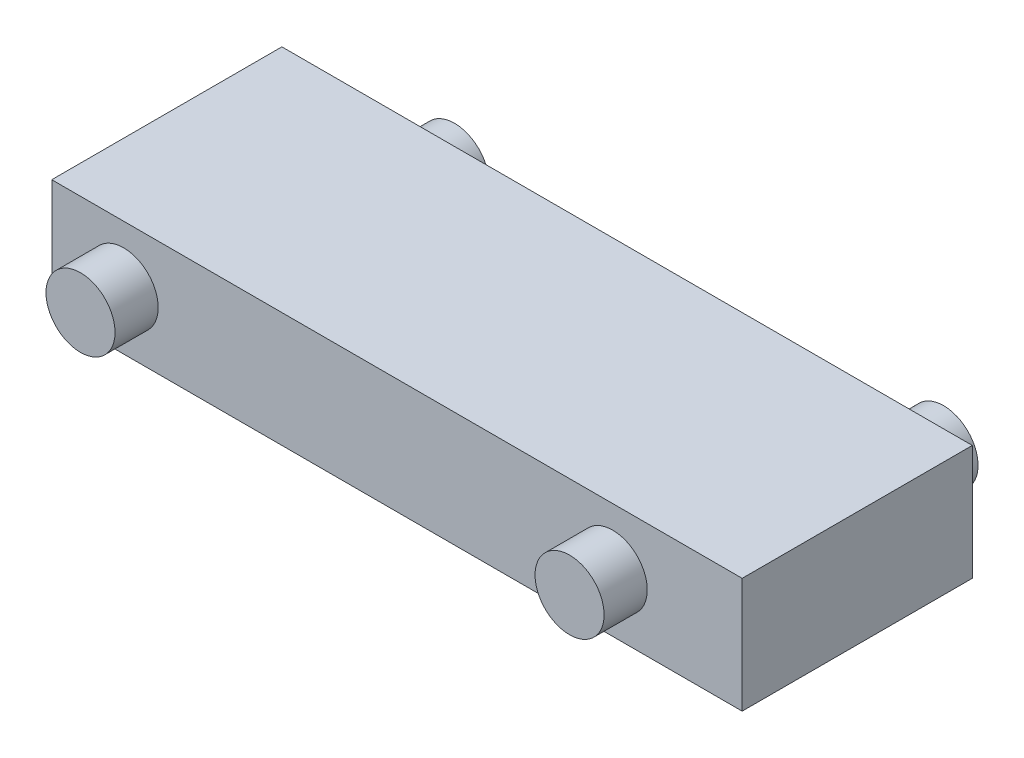
ISO-10303-21;
HEADER;
FILE_DESCRIPTION(('STEP AP214'),'2;1');
FILE_NAME('part.step','',(''),(''),'','','');
FILE_SCHEMA(('AUTOMOTIVE_DESIGN { 1 0 10303 214 1 1 1 1 }'));
ENDSEC;
DATA;
#1=APPLICATION_CONTEXT('core data for automotive mechanical design processes');
#2=APPLICATION_PROTOCOL_DEFINITION('international standard','automotive_design',2000,#1);
#3=PRODUCT_CONTEXT('',#1,'mechanical');
#4=PRODUCT('Part','Part','',(#3));
#5=PRODUCT_RELATED_PRODUCT_CATEGORY('part','',(#4));
#6=PRODUCT_DEFINITION_FORMATION('','',#4);
#7=PRODUCT_DEFINITION_CONTEXT('part definition',#1,'design');
#8=PRODUCT_DEFINITION('design','',#6,#7);
#9=PRODUCT_DEFINITION_SHAPE('','',#8);
#10=(LENGTH_UNIT() NAMED_UNIT(*) SI_UNIT(.MILLI.,.METRE.));
#11=(NAMED_UNIT(*) PLANE_ANGLE_UNIT() SI_UNIT($,.RADIAN.));
#12=(NAMED_UNIT(*) SI_UNIT($,.STERADIAN.) SOLID_ANGLE_UNIT());
#13=UNCERTAINTY_MEASURE_WITH_UNIT(LENGTH_MEASURE(1.E-05),#10,'distance_accuracy_value','');
#14=(GEOMETRIC_REPRESENTATION_CONTEXT(3) GLOBAL_UNCERTAINTY_ASSIGNED_CONTEXT((#13)) GLOBAL_UNIT_ASSIGNED_CONTEXT((#10,
#11,#12)) REPRESENTATION_CONTEXT('',''));
#15=CARTESIAN_POINT('',(0.,0.,0.));
#16=DIRECTION('',(0.,0.,1.));
#17=DIRECTION('',(1.,0.,0.));
#18=AXIS2_PLACEMENT_3D('',#15,#16,#17);
#19=CARTESIAN_POINT('',(0.,0.,80.));
#20=DIRECTION('',(1.,0.,0.));
#21=DIRECTION('',(0.,0.,-1.));
#22=AXIS2_PLACEMENT_3D('',#19,#20,#21);
#23=PLANE('',#22);
#24=DIRECTION('',(0.,-1.,0.));
#25=VECTOR('',#24,1.);
#26=CARTESIAN_POINT('',(0.,0.,0.));
#27=LINE('',#26,#25);
#28=CARTESIAN_POINT('',(0.,40.,0.));
#29=VERTEX_POINT('',#28);
#30=CARTESIAN_POINT('',(0.,0.,0.));
#31=VERTEX_POINT('',#30);
#32=EDGE_CURVE('E102',#29,#31,#27,.T.);
#33=ORIENTED_EDGE('',*,*,#32,.T.);
#34=DIRECTION('',(0.,0.,-1.));
#35=VECTOR('',#34,1.);
#36=CARTESIAN_POINT('',(0.,0.,80.));
#37=LINE('',#36,#35);
#38=CARTESIAN_POINT('',(0.,0.,80.));
#39=VERTEX_POINT('',#38);
#40=EDGE_CURVE('E93',#39,#31,#37,.T.);
#41=ORIENTED_EDGE('',*,*,#40,.F.);
#42=DIRECTION('',(0.,-1.,0.));
#43=VECTOR('',#42,1.);
#44=CARTESIAN_POINT('',(0.,0.,80.));
#45=LINE('',#44,#43);
#46=CARTESIAN_POINT('',(0.,40.,80.));
#47=VERTEX_POINT('',#46);
#48=EDGE_CURVE('E87',#47,#39,#45,.T.);
#49=ORIENTED_EDGE('',*,*,#48,.F.);
#50=DIRECTION('',(0.,0.,-1.));
#51=VECTOR('',#50,1.);
#52=CARTESIAN_POINT('',(0.,40.,80.));
#53=LINE('',#52,#51);
#54=EDGE_CURVE('E98',#47,#29,#53,.T.);
#55=ORIENTED_EDGE('',*,*,#54,.T.);
#56=EDGE_LOOP('',(#33,#41,#49,#55));
#57=FACE_BOUND('',#56,.T.);
#58=ADVANCED_FACE('F35',(#57),#23,.F.);
#59=CARTESIAN_POINT('',(0.,0.,80.));
#60=DIRECTION('',(0.,1.,0.));
#61=DIRECTION('',(0.,0.,1.));
#62=AXIS2_PLACEMENT_3D('',#59,#60,#61);
#63=PLANE('',#62);
#64=DIRECTION('',(1.,0.,0.));
#65=VECTOR('',#64,1.);
#66=CARTESIAN_POINT('',(0.,0.,0.));
#67=LINE('',#66,#65);
#68=CARTESIAN_POINT('',(240.,0.,0.));
#69=VERTEX_POINT('',#68);
#70=EDGE_CURVE('E92',#31,#69,#67,.T.);
#71=ORIENTED_EDGE('',*,*,#70,.T.);
#72=DIRECTION('',(0.,0.,-1.));
#73=VECTOR('',#72,1.);
#74=CARTESIAN_POINT('',(240.,0.,80.));
#75=LINE('',#74,#73);
#76=CARTESIAN_POINT('',(240.,0.,80.));
#77=VERTEX_POINT('',#76);
#78=EDGE_CURVE('E90',#77,#69,#75,.T.);
#79=ORIENTED_EDGE('',*,*,#78,.F.);
#80=DIRECTION('',(1.,0.,0.));
#81=VECTOR('',#80,1.);
#82=CARTESIAN_POINT('',(0.,0.,80.));
#83=LINE('',#82,#81);
#84=EDGE_CURVE('E82',#39,#77,#83,.T.);
#85=ORIENTED_EDGE('',*,*,#84,.F.);
#86=ORIENTED_EDGE('',*,*,#40,.T.);
#87=EDGE_LOOP('',(#71,#79,#85,#86));
#88=FACE_BOUND('',#87,.T.);
#89=ADVANCED_FACE('F91',(#88),#63,.F.);
#90=CARTESIAN_POINT('',(240.,0.,80.));
#91=DIRECTION('',(-1.,0.,0.));
#92=DIRECTION('',(0.,0.,1.));
#93=AXIS2_PLACEMENT_3D('',#90,#91,#92);
#94=PLANE('',#93);
#95=DIRECTION('',(0.,1.,0.));
#96=VECTOR('',#95,1.);
#97=CARTESIAN_POINT('',(240.,0.,0.));
#98=LINE('',#97,#96);
#99=CARTESIAN_POINT('',(240.,40.,0.));
#100=VERTEX_POINT('',#99);
#101=EDGE_CURVE('E68',#69,#100,#98,.T.);
#102=ORIENTED_EDGE('',*,*,#101,.T.);
#103=DIRECTION('',(0.,0.,-1.));
#104=VECTOR('',#103,1.);
#105=CARTESIAN_POINT('',(240.,40.,80.));
#106=LINE('',#105,#104);
#107=CARTESIAN_POINT('',(240.,40.,80.));
#108=VERTEX_POINT('',#107);
#109=EDGE_CURVE('E94',#108,#100,#106,.T.);
#110=ORIENTED_EDGE('',*,*,#109,.F.);
#111=DIRECTION('',(0.,1.,0.));
#112=VECTOR('',#111,1.);
#113=CARTESIAN_POINT('',(240.,0.,80.));
#114=LINE('',#113,#112);
#115=EDGE_CURVE('E85',#77,#108,#114,.T.);
#116=ORIENTED_EDGE('',*,*,#115,.F.);
#117=ORIENTED_EDGE('',*,*,#78,.T.);
#118=EDGE_LOOP('',(#102,#110,#116,#117));
#119=FACE_BOUND('',#118,.T.);
#120=ADVANCED_FACE('F96',(#119),#94,.F.);
#121=CARTESIAN_POINT('',(0.,40.,80.));
#122=DIRECTION('',(0.,-1.,0.));
#123=DIRECTION('',(0.,0.,-1.));
#124=AXIS2_PLACEMENT_3D('',#121,#122,#123);
#125=PLANE('',#124);
#126=DIRECTION('',(-1.,0.,0.));
#127=VECTOR('',#126,1.);
#128=CARTESIAN_POINT('',(0.,40.,0.));
#129=LINE('',#128,#127);
#130=EDGE_CURVE('E74',#100,#29,#129,.T.);
#131=ORIENTED_EDGE('',*,*,#130,.T.);
#132=ORIENTED_EDGE('',*,*,#54,.F.);
#133=DIRECTION('',(-1.,0.,0.));
#134=VECTOR('',#133,1.);
#135=CARTESIAN_POINT('',(0.,40.,80.));
#136=LINE('',#135,#134);
#137=EDGE_CURVE('E51',#108,#47,#136,.T.);
#138=ORIENTED_EDGE('',*,*,#137,.F.);
#139=ORIENTED_EDGE('',*,*,#109,.T.);
#140=EDGE_LOOP('',(#131,#132,#138,#139));
#141=FACE_BOUND('',#140,.T.);
#142=ADVANCED_FACE('F118',(#141),#125,.F.);
#143=CARTESIAN_POINT('',(0.,0.,80.));
#144=DIRECTION('',(0.,0.,-1.));
#145=DIRECTION('',(-1.,0.,0.));
#146=AXIS2_PLACEMENT_3D('',#143,#144,#145);
#147=PLANE('',#146);
#148=CARTESIAN_POINT('',(195.,20.,80.));
#149=DIRECTION('',(0.,0.,-1.));
#150=DIRECTION('',(-1.,0.,0.));
#151=AXIS2_PLACEMENT_3D('',#148,#149,#150);
#152=CIRCLE('',#151,12.);
#153=CARTESIAN_POINT('',(183.,20.,80.));
#154=VERTEX_POINT('',#153);
#155=EDGE_CURVE('E11',#154,#154,#152,.F.);
#156=ORIENTED_EDGE('',*,*,#155,.F.);
#157=EDGE_LOOP('',(#156));
#158=FACE_BOUND('',#157,.T.);
#159=CARTESIAN_POINT('',(25.,20.,80.));
#160=DIRECTION('',(0.,0.,-1.));
#161=DIRECTION('',(-1.,0.,0.));
#162=AXIS2_PLACEMENT_3D('',#159,#160,#161);
#163=CIRCLE('',#162,12.);
#164=CARTESIAN_POINT('',(13.,20.,80.));
#165=VERTEX_POINT('',#164);
#166=EDGE_CURVE('E43',#165,#165,#163,.F.);
#167=ORIENTED_EDGE('',*,*,#166,.F.);
#168=EDGE_LOOP('',(#167));
#169=FACE_BOUND('',#168,.T.);
#170=ORIENTED_EDGE('',*,*,#48,.T.);
#171=ORIENTED_EDGE('',*,*,#84,.T.);
#172=ORIENTED_EDGE('',*,*,#115,.T.);
#173=ORIENTED_EDGE('',*,*,#137,.T.);
#174=EDGE_LOOP('',(#170,#171,#172,#173));
#175=FACE_BOUND('',#174,.T.);
#176=ADVANCED_FACE('F83',(#158,#169,#175),#147,.F.);
#177=CARTESIAN_POINT('',(0.,0.,0.));
#178=DIRECTION('',(0.,0.,-1.));
#179=DIRECTION('',(-1.,0.,0.));
#180=AXIS2_PLACEMENT_3D('',#177,#178,#179);
#181=PLANE('',#180);
#182=CARTESIAN_POINT('',(45.,20.,0.));
#183=DIRECTION('',(0.,0.,-1.));
#184=DIRECTION('',(-1.,0.,0.));
#185=AXIS2_PLACEMENT_3D('',#182,#183,#184);
#186=CIRCLE('',#185,12.);
#187=CARTESIAN_POINT('',(33.,20.,0.));
#188=VERTEX_POINT('',#187);
#189=EDGE_CURVE('E145',#188,#188,#186,.T.);
#190=ORIENTED_EDGE('',*,*,#189,.F.);
#191=EDGE_LOOP('',(#190));
#192=FACE_BOUND('',#191,.T.);
#193=CARTESIAN_POINT('',(215.,20.,0.));
#194=DIRECTION('',(0.,0.,-1.));
#195=DIRECTION('',(-1.,0.,0.));
#196=AXIS2_PLACEMENT_3D('',#193,#194,#195);
#197=CIRCLE('',#196,12.);
#198=CARTESIAN_POINT('',(203.,20.,0.));
#199=VERTEX_POINT('',#198);
#200=EDGE_CURVE('E139',#199,#199,#197,.T.);
#201=ORIENTED_EDGE('',*,*,#200,.F.);
#202=EDGE_LOOP('',(#201));
#203=FACE_BOUND('',#202,.T.);
#204=ORIENTED_EDGE('',*,*,#32,.F.);
#205=ORIENTED_EDGE('',*,*,#130,.F.);
#206=ORIENTED_EDGE('',*,*,#101,.F.);
#207=ORIENTED_EDGE('',*,*,#70,.F.);
#208=EDGE_LOOP('',(#204,#205,#206,#207));
#209=FACE_BOUND('',#208,.T.);
#210=ADVANCED_FACE('F117',(#192,#203,#209),#181,.T.);
#211=CARTESIAN_POINT('',(215.,20.,-15.));
#212=DIRECTION('',(0.,0.,1.));
#213=DIRECTION('',(1.,0.,0.));
#214=AXIS2_PLACEMENT_3D('',#211,#212,#213);
#215=CYLINDRICAL_SURFACE('',#214,12.);
#216=CARTESIAN_POINT('',(215.,20.,-15.));
#217=DIRECTION('',(0.,0.,-1.));
#218=DIRECTION('',(-1.,0.,0.));
#219=AXIS2_PLACEMENT_3D('',#216,#217,#218);
#220=CIRCLE('',#219,12.);
#221=CARTESIAN_POINT('',(203.,20.,-15.));
#222=VERTEX_POINT('',#221);
#223=EDGE_CURVE('E105',#222,#222,#220,.T.);
#224=ORIENTED_EDGE('',*,*,#223,.F.);
#225=EDGE_LOOP('',(#224));
#226=FACE_BOUND('',#225,.T.);
#227=ORIENTED_EDGE('',*,*,#200,.T.);
#228=EDGE_LOOP('',(#227));
#229=FACE_BOUND('',#228,.T.);
#230=ADVANCED_FACE('F125',(#226,#229),#215,.T.);
#231=CARTESIAN_POINT('',(215.,20.,-15.));
#232=DIRECTION('',(0.,0.,-1.));
#233=DIRECTION('',(-1.,0.,0.));
#234=AXIS2_PLACEMENT_3D('',#231,#232,#233);
#235=PLANE('',#234);
#236=ORIENTED_EDGE('',*,*,#223,.T.);
#237=EDGE_LOOP('',(#236));
#238=FACE_BOUND('',#237,.T.);
#239=ADVANCED_FACE('F182',(#238),#235,.T.);
#240=CARTESIAN_POINT('',(45.,20.,-15.));
#241=DIRECTION('',(0.,0.,1.));
#242=DIRECTION('',(1.,0.,0.));
#243=AXIS2_PLACEMENT_3D('',#240,#241,#242);
#244=CYLINDRICAL_SURFACE('',#243,12.);
#245=CARTESIAN_POINT('',(45.,20.,-15.));
#246=DIRECTION('',(0.,0.,-1.));
#247=DIRECTION('',(-1.,0.,0.));
#248=AXIS2_PLACEMENT_3D('',#245,#246,#247);
#249=CIRCLE('',#248,12.);
#250=CARTESIAN_POINT('',(33.,20.,-15.));
#251=VERTEX_POINT('',#250);
#252=EDGE_CURVE('E142',#251,#251,#249,.T.);
#253=ORIENTED_EDGE('',*,*,#252,.F.);
#254=EDGE_LOOP('',(#253));
#255=FACE_BOUND('',#254,.T.);
#256=ORIENTED_EDGE('',*,*,#189,.T.);
#257=EDGE_LOOP('',(#256));
#258=FACE_BOUND('',#257,.T.);
#259=ADVANCED_FACE('F178',(#255,#258),#244,.T.);
#260=CARTESIAN_POINT('',(45.,20.,-15.));
#261=DIRECTION('',(0.,0.,-1.));
#262=DIRECTION('',(-1.,0.,0.));
#263=AXIS2_PLACEMENT_3D('',#260,#261,#262);
#264=PLANE('',#263);
#265=ORIENTED_EDGE('',*,*,#252,.T.);
#266=EDGE_LOOP('',(#265));
#267=FACE_BOUND('',#266,.T.);
#268=ADVANCED_FACE('F174',(#267),#264,.T.);
#269=CARTESIAN_POINT('',(25.,20.,95.));
#270=DIRECTION('',(0.,0.,-1.));
#271=DIRECTION('',(-1.,0.,0.));
#272=AXIS2_PLACEMENT_3D('',#269,#270,#271);
#273=CYLINDRICAL_SURFACE('',#272,12.);
#274=CARTESIAN_POINT('',(25.,20.,95.));
#275=DIRECTION('',(0.,0.,1.));
#276=DIRECTION('',(1.,0.,0.));
#277=AXIS2_PLACEMENT_3D('',#274,#275,#276);
#278=CIRCLE('',#277,12.);
#279=CARTESIAN_POINT('',(37.,20.,95.));
#280=VERTEX_POINT('',#279);
#281=EDGE_CURVE('E148',#280,#280,#278,.T.);
#282=ORIENTED_EDGE('',*,*,#281,.F.);
#283=EDGE_LOOP('',(#282));
#284=FACE_BOUND('',#283,.T.);
#285=ORIENTED_EDGE('',*,*,#166,.T.);
#286=EDGE_LOOP('',(#285));
#287=FACE_BOUND('',#286,.T.);
#288=ADVANCED_FACE('F114',(#284,#287),#273,.T.);
#289=CARTESIAN_POINT('',(25.,20.,95.));
#290=DIRECTION('',(0.,0.,1.));
#291=DIRECTION('',(1.,0.,0.));
#292=AXIS2_PLACEMENT_3D('',#289,#290,#291);
#293=PLANE('',#292);
#294=ORIENTED_EDGE('',*,*,#281,.T.);
#295=EDGE_LOOP('',(#294));
#296=FACE_BOUND('',#295,.T.);
#297=ADVANCED_FACE('F162',(#296),#293,.T.);
#298=CARTESIAN_POINT('',(195.,20.,95.));
#299=DIRECTION('',(0.,0.,-1.));
#300=DIRECTION('',(-1.,0.,0.));
#301=AXIS2_PLACEMENT_3D('',#298,#299,#300);
#302=CYLINDRICAL_SURFACE('',#301,12.);
#303=CARTESIAN_POINT('',(195.,20.,95.));
#304=DIRECTION('',(0.,0.,1.));
#305=DIRECTION('',(1.,0.,0.));
#306=AXIS2_PLACEMENT_3D('',#303,#304,#305);
#307=CIRCLE('',#306,12.);
#308=CARTESIAN_POINT('',(207.,20.,95.));
#309=VERTEX_POINT('',#308);
#310=EDGE_CURVE('E153',#309,#309,#307,.T.);
#311=ORIENTED_EDGE('',*,*,#310,.F.);
#312=EDGE_LOOP('',(#311));
#313=FACE_BOUND('',#312,.T.);
#314=ORIENTED_EDGE('',*,*,#155,.T.);
#315=EDGE_LOOP('',(#314));
#316=FACE_BOUND('',#315,.T.);
#317=ADVANCED_FACE('F159',(#313,#316),#302,.T.);
#318=CARTESIAN_POINT('',(195.,20.,95.));
#319=DIRECTION('',(0.,0.,1.));
#320=DIRECTION('',(1.,0.,0.));
#321=AXIS2_PLACEMENT_3D('',#318,#319,#320);
#322=PLANE('',#321);
#323=ORIENTED_EDGE('',*,*,#310,.T.);
#324=EDGE_LOOP('',(#323));
#325=FACE_BOUND('',#324,.T.);
#326=ADVANCED_FACE('F157',(#325),#322,.T.);
#327=CLOSED_SHELL('',(#58,#89,#120,#142,#176,#210,#230,#239,#259,#268,#288,#297,#317,#326));
#328=MANIFOLD_SOLID_BREP('B2',#327);
#329=ADVANCED_BREP_SHAPE_REPRESENTATION('',(#18,#328),#14);
#330=SHAPE_DEFINITION_REPRESENTATION(#9,#329);
ENDSEC;
END-ISO-10303-21;
